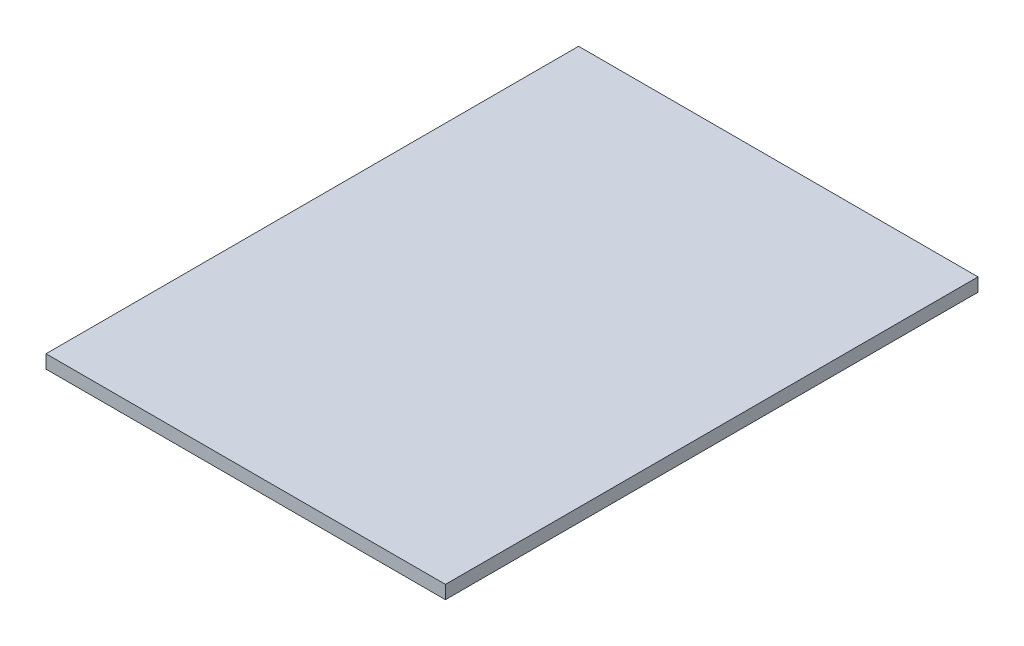
ISO-10303-21;
HEADER;
FILE_DESCRIPTION(('STEP AP214'),'2;1');
FILE_NAME('part.step','',(''),(''),'','','');
FILE_SCHEMA(('AUTOMOTIVE_DESIGN { 1 0 10303 214 1 1 1 1 }'));
ENDSEC;
DATA;
#1=APPLICATION_CONTEXT('core data for automotive mechanical design processes');
#2=APPLICATION_PROTOCOL_DEFINITION('international standard','automotive_design',2000,#1);
#3=PRODUCT_CONTEXT('',#1,'mechanical');
#4=PRODUCT('Part','Part','',(#3));
#5=PRODUCT_RELATED_PRODUCT_CATEGORY('part','',(#4));
#6=PRODUCT_DEFINITION_FORMATION('','',#4);
#7=PRODUCT_DEFINITION_CONTEXT('part definition',#1,'design');
#8=PRODUCT_DEFINITION('design','',#6,#7);
#9=PRODUCT_DEFINITION_SHAPE('','',#8);
#10=(LENGTH_UNIT() NAMED_UNIT(*) SI_UNIT(.MILLI.,.METRE.));
#11=(NAMED_UNIT(*) PLANE_ANGLE_UNIT() SI_UNIT($,.RADIAN.));
#12=(NAMED_UNIT(*) SI_UNIT($,.STERADIAN.) SOLID_ANGLE_UNIT());
#13=UNCERTAINTY_MEASURE_WITH_UNIT(LENGTH_MEASURE(1.E-05),#10,'distance_accuracy_value','');
#14=(GEOMETRIC_REPRESENTATION_CONTEXT(3) GLOBAL_UNCERTAINTY_ASSIGNED_CONTEXT((#13)) GLOBAL_UNIT_ASSIGNED_CONTEXT((#10,
#11,#12)) REPRESENTATION_CONTEXT('',''));
#15=CARTESIAN_POINT('',(0.,0.,0.));
#16=DIRECTION('',(0.,0.,1.));
#17=DIRECTION('',(1.,0.,0.));
#18=AXIS2_PLACEMENT_3D('',#15,#16,#17);
#19=CARTESIAN_POINT('',(47.625,3.175,63.5));
#20=DIRECTION('',(-1.,0.,0.));
#21=DIRECTION('',(0.,0.,1.));
#22=AXIS2_PLACEMENT_3D('',#19,#20,#21);
#23=PLANE('',#22);
#24=DIRECTION('',(0.,0.,-1.));
#25=VECTOR('',#24,1.);
#26=CARTESIAN_POINT('',(47.625,0.,63.5));
#27=LINE('',#26,#25);
#28=CARTESIAN_POINT('',(47.625,0.,63.5));
#29=VERTEX_POINT('',#28);
#30=CARTESIAN_POINT('',(47.625,0.,-63.5));
#31=VERTEX_POINT('',#30);
#32=EDGE_CURVE('E95',#29,#31,#27,.T.);
#33=ORIENTED_EDGE('',*,*,#32,.T.);
#34=DIRECTION('',(0.,-1.,0.));
#35=VECTOR('',#34,1.);
#36=CARTESIAN_POINT('',(47.625,3.175,-63.5));
#37=LINE('',#36,#35);
#38=CARTESIAN_POINT('',(47.625,3.175,-63.5));
#39=VERTEX_POINT('',#38);
#40=EDGE_CURVE('E11',#39,#31,#37,.T.);
#41=ORIENTED_EDGE('',*,*,#40,.F.);
#42=DIRECTION('',(0.,0.,-1.));
#43=VECTOR('',#42,1.);
#44=CARTESIAN_POINT('',(47.625,3.175,63.5));
#45=LINE('',#44,#43);
#46=CARTESIAN_POINT('',(47.625,3.175,63.5));
#47=VERTEX_POINT('',#46);
#48=EDGE_CURVE('E83',#47,#39,#45,.T.);
#49=ORIENTED_EDGE('',*,*,#48,.F.);
#50=DIRECTION('',(0.,-1.,0.));
#51=VECTOR('',#50,1.);
#52=CARTESIAN_POINT('',(47.625,3.175,63.5));
#53=LINE('',#52,#51);
#54=EDGE_CURVE('E91',#47,#29,#53,.T.);
#55=ORIENTED_EDGE('',*,*,#54,.T.);
#56=EDGE_LOOP('',(#33,#41,#49,#55));
#57=FACE_BOUND('',#56,.T.);
#58=ADVANCED_FACE('F32',(#57),#23,.F.);
#59=CARTESIAN_POINT('',(-47.625,3.175,-63.5));
#60=DIRECTION('',(0.,0.,1.));
#61=DIRECTION('',(1.,0.,0.));
#62=AXIS2_PLACEMENT_3D('',#59,#60,#61);
#63=PLANE('',#62);
#64=DIRECTION('',(-1.,0.,0.));
#65=VECTOR('',#64,1.);
#66=CARTESIAN_POINT('',(-47.625,0.,-63.5));
#67=LINE('',#66,#65);
#68=CARTESIAN_POINT('',(-47.625,0.,-63.5));
#69=VERTEX_POINT('',#68);
#70=EDGE_CURVE('E87',#31,#69,#67,.T.);
#71=ORIENTED_EDGE('',*,*,#70,.T.);
#72=DIRECTION('',(0.,-1.,0.));
#73=VECTOR('',#72,1.);
#74=CARTESIAN_POINT('',(-47.625,3.175,-63.5));
#75=LINE('',#74,#73);
#76=CARTESIAN_POINT('',(-47.625,3.175,-63.5));
#77=VERTEX_POINT('',#76);
#78=EDGE_CURVE('E40',#77,#69,#75,.T.);
#79=ORIENTED_EDGE('',*,*,#78,.F.);
#80=DIRECTION('',(-1.,0.,0.));
#81=VECTOR('',#80,1.);
#82=CARTESIAN_POINT('',(-47.625,3.175,-63.5));
#83=LINE('',#82,#81);
#84=EDGE_CURVE('E78',#39,#77,#83,.T.);
#85=ORIENTED_EDGE('',*,*,#84,.F.);
#86=ORIENTED_EDGE('',*,*,#40,.T.);
#87=EDGE_LOOP('',(#71,#79,#85,#86));
#88=FACE_BOUND('',#87,.T.);
#89=ADVANCED_FACE('F86',(#88),#63,.F.);
#90=CARTESIAN_POINT('',(-47.625,3.175,63.5));
#91=DIRECTION('',(1.,0.,0.));
#92=DIRECTION('',(0.,0.,-1.));
#93=AXIS2_PLACEMENT_3D('',#90,#91,#92);
#94=PLANE('',#93);
#95=DIRECTION('',(0.,0.,1.));
#96=VECTOR('',#95,1.);
#97=CARTESIAN_POINT('',(-47.625,0.,63.5));
#98=LINE('',#97,#96);
#99=CARTESIAN_POINT('',(-47.625,0.,63.5));
#100=VERTEX_POINT('',#99);
#101=EDGE_CURVE('E65',#69,#100,#98,.T.);
#102=ORIENTED_EDGE('',*,*,#101,.T.);
#103=DIRECTION('',(0.,-1.,0.));
#104=VECTOR('',#103,1.);
#105=CARTESIAN_POINT('',(-47.625,3.175,63.5));
#106=LINE('',#105,#104);
#107=CARTESIAN_POINT('',(-47.625,3.175,63.5));
#108=VERTEX_POINT('',#107);
#109=EDGE_CURVE('E88',#108,#100,#106,.T.);
#110=ORIENTED_EDGE('',*,*,#109,.F.);
#111=DIRECTION('',(0.,0.,1.));
#112=VECTOR('',#111,1.);
#113=CARTESIAN_POINT('',(-47.625,3.175,63.5));
#114=LINE('',#113,#112);
#115=EDGE_CURVE('E81',#77,#108,#114,.T.);
#116=ORIENTED_EDGE('',*,*,#115,.F.);
#117=ORIENTED_EDGE('',*,*,#78,.T.);
#118=EDGE_LOOP('',(#102,#110,#116,#117));
#119=FACE_BOUND('',#118,.T.);
#120=ADVANCED_FACE('F89',(#119),#94,.F.);
#121=CARTESIAN_POINT('',(-47.625,3.175,63.5));
#122=DIRECTION('',(0.,0.,-1.));
#123=DIRECTION('',(-1.,0.,0.));
#124=AXIS2_PLACEMENT_3D('',#121,#122,#123);
#125=PLANE('',#124);
#126=DIRECTION('',(1.,0.,0.));
#127=VECTOR('',#126,1.);
#128=CARTESIAN_POINT('',(-47.625,0.,63.5));
#129=LINE('',#128,#127);
#130=EDGE_CURVE('E71',#100,#29,#129,.T.);
#131=ORIENTED_EDGE('',*,*,#130,.T.);
#132=ORIENTED_EDGE('',*,*,#54,.F.);
#133=DIRECTION('',(1.,0.,0.));
#134=VECTOR('',#133,1.);
#135=CARTESIAN_POINT('',(-47.625,3.175,63.5));
#136=LINE('',#135,#134);
#137=EDGE_CURVE('E48',#108,#47,#136,.T.);
#138=ORIENTED_EDGE('',*,*,#137,.F.);
#139=ORIENTED_EDGE('',*,*,#109,.T.);
#140=EDGE_LOOP('',(#131,#132,#138,#139));
#141=FACE_BOUND('',#140,.T.);
#142=ADVANCED_FACE('F102',(#141),#125,.F.);
#143=CARTESIAN_POINT('',(0.,3.175,0.));
#144=DIRECTION('',(0.,-1.,0.));
#145=DIRECTION('',(0.,0.,-1.));
#146=AXIS2_PLACEMENT_3D('',#143,#144,#145);
#147=PLANE('',#146);
#148=ORIENTED_EDGE('',*,*,#48,.T.);
#149=ORIENTED_EDGE('',*,*,#84,.T.);
#150=ORIENTED_EDGE('',*,*,#115,.T.);
#151=ORIENTED_EDGE('',*,*,#137,.T.);
#152=EDGE_LOOP('',(#148,#149,#150,#151));
#153=FACE_BOUND('',#152,.T.);
#154=ADVANCED_FACE('F79',(#153),#147,.F.);
#155=CARTESIAN_POINT('',(0.,0.,0.));
#156=DIRECTION('',(0.,-1.,0.));
#157=DIRECTION('',(0.,0.,-1.));
#158=AXIS2_PLACEMENT_3D('',#155,#156,#157);
#159=PLANE('',#158);
#160=ORIENTED_EDGE('',*,*,#32,.F.);
#161=ORIENTED_EDGE('',*,*,#130,.F.);
#162=ORIENTED_EDGE('',*,*,#101,.F.);
#163=ORIENTED_EDGE('',*,*,#70,.F.);
#164=EDGE_LOOP('',(#160,#161,#162,#163));
#165=FACE_BOUND('',#164,.T.);
#166=ADVANCED_FACE('F105',(#165),#159,.T.);
#167=CLOSED_SHELL('',(#58,#89,#120,#142,#154,#166));
#168=MANIFOLD_SOLID_BREP('B2',#167);
#169=ADVANCED_BREP_SHAPE_REPRESENTATION('',(#18,#168),#14);
#170=SHAPE_DEFINITION_REPRESENTATION(#9,#169);
ENDSEC;
END-ISO-10303-21;
